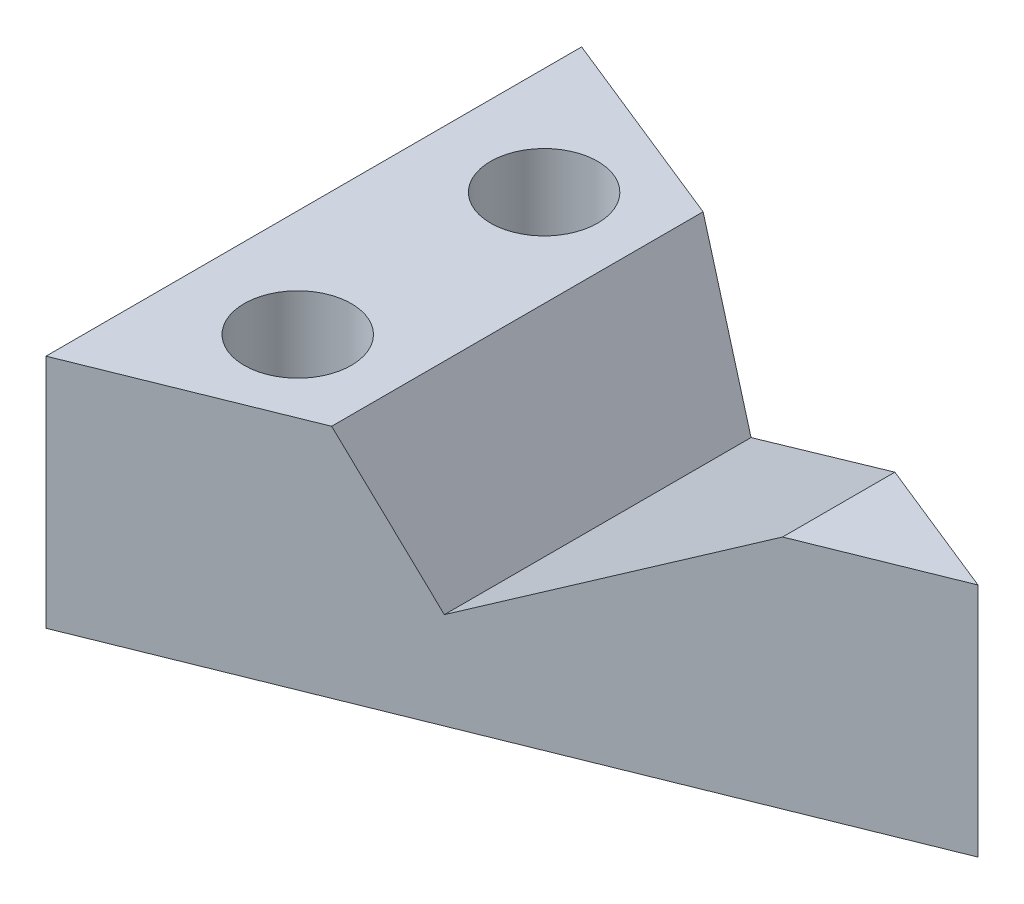
ISO-10303-21;
HEADER;
FILE_DESCRIPTION(('STEP AP214'),'2;1');
FILE_NAME('part.step','',(''),(''),'','','');
FILE_SCHEMA(('AUTOMOTIVE_DESIGN { 1 0 10303 214 1 1 1 1 }'));
ENDSEC;
DATA;
#1=APPLICATION_CONTEXT('core data for automotive mechanical design processes');
#2=APPLICATION_PROTOCOL_DEFINITION('international standard','automotive_design',2000,#1);
#3=PRODUCT_CONTEXT('',#1,'mechanical');
#4=PRODUCT('Part','Part','',(#3));
#5=PRODUCT_RELATED_PRODUCT_CATEGORY('part','',(#4));
#6=PRODUCT_DEFINITION_FORMATION('','',#4);
#7=PRODUCT_DEFINITION_CONTEXT('part definition',#1,'design');
#8=PRODUCT_DEFINITION('design','',#6,#7);
#9=PRODUCT_DEFINITION_SHAPE('','',#8);
#10=(LENGTH_UNIT() NAMED_UNIT(*) SI_UNIT(.MILLI.,.METRE.));
#11=(NAMED_UNIT(*) PLANE_ANGLE_UNIT() SI_UNIT($,.RADIAN.));
#12=(NAMED_UNIT(*) SI_UNIT($,.STERADIAN.) SOLID_ANGLE_UNIT());
#13=UNCERTAINTY_MEASURE_WITH_UNIT(LENGTH_MEASURE(1.E-05),#10,'distance_accuracy_value','');
#14=(GEOMETRIC_REPRESENTATION_CONTEXT(3) GLOBAL_UNCERTAINTY_ASSIGNED_CONTEXT((#13)) GLOBAL_UNIT_ASSIGNED_CONTEXT((#10,
#11,#12)) REPRESENTATION_CONTEXT('',''));
#15=CARTESIAN_POINT('',(0.,0.,0.));
#16=DIRECTION('',(0.,0.,1.));
#17=DIRECTION('',(1.,0.,0.));
#18=AXIS2_PLACEMENT_3D('',#15,#16,#17);
#19=CARTESIAN_POINT('',(-62.,22.,25.));
#20=DIRECTION('',(-0.37396833549694,0.,-0.927441472032412));
#21=DIRECTION('',(-0.927441472032412,0.,0.37396833549694));
#22=AXIS2_PLACEMENT_3D('',#19,#20,#21);
#23=PLANE('',#22);
#24=DIRECTION('',(0.490137720761641,-0.848943435065173,-0.197636177726468));
#25=VECTOR('',#24,1.);
#26=CARTESIAN_POINT('',(-48.3066058371351,31.1913109256597,19.478470095619));
#27=LINE('',#26,#25);
#28=CARTESIAN_POINT('',(-43.,22.,17.3387096774194));
#29=VERTEX_POINT('',#28);
#30=CARTESIAN_POINT('',(-35.5,9.00961894323338,14.3145161290323));
#31=VERTEX_POINT('',#30);
#32=EDGE_CURVE('E96',#29,#31,#27,.T.);
#33=ORIENTED_EDGE('',*,*,#32,.F.);
#34=DIRECTION('',(0.927441472032412,0.,-0.37396833549694));
#35=VECTOR('',#34,1.);
#36=CARTESIAN_POINT('',(-62.,22.,25.));
#37=LINE('',#36,#35);
#38=CARTESIAN_POINT('',(-62.,22.,25.));
#39=VERTEX_POINT('',#38);
#40=EDGE_CURVE('E116',#39,#29,#37,.T.);
#41=ORIENTED_EDGE('',*,*,#40,.F.);
#42=DIRECTION('',(0.,-1.,0.));
#43=VECTOR('',#42,1.);
#44=CARTESIAN_POINT('',(-62.,22.,25.));
#45=LINE('',#44,#43);
#46=CARTESIAN_POINT('',(-62.,0.,25.));
#47=VERTEX_POINT('',#46);
#48=EDGE_CURVE('E122',#39,#47,#45,.T.);
#49=ORIENTED_EDGE('',*,*,#48,.T.);
#50=DIRECTION('',(0.927441472032412,0.,-0.37396833549694));
#51=VECTOR('',#50,1.);
#52=CARTESIAN_POINT('',(-62.,0.,25.));
#53=LINE('',#52,#51);
#54=CARTESIAN_POINT('',(0.,0.,0.));
#55=VERTEX_POINT('',#54);
#56=EDGE_CURVE('E103',#47,#55,#53,.T.);
#57=ORIENTED_EDGE('',*,*,#56,.T.);
#58=DIRECTION('',(0.,-1.,0.));
#59=VECTOR('',#58,1.);
#60=CARTESIAN_POINT('',(0.,22.,0.));
#61=LINE('',#60,#59);
#62=CARTESIAN_POINT('',(0.,22.,0.));
#63=VERTEX_POINT('',#62);
#64=EDGE_CURVE('E131',#63,#55,#61,.T.);
#65=ORIENTED_EDGE('',*,*,#64,.F.);
#66=CARTESIAN_POINT('',(-13.,22.,5.24193548387097));
#67=VERTEX_POINT('',#66);
#68=EDGE_CURVE('E79',#67,#63,#37,.T.);
#69=ORIENTED_EDGE('',*,*,#68,.F.);
#70=DIRECTION('',(0.81760808856905,0.472046250026958,-0.329680680874617));
#71=VECTOR('',#70,1.);
#72=CARTESIAN_POINT('',(-51.0814445539389,0.0136677356535331,20.5973566749753));
#73=LINE('',#72,#71);
#74=EDGE_CURVE('E47',#31,#67,#73,.T.);
#75=ORIENTED_EDGE('',*,*,#74,.F.);
#76=EDGE_LOOP('',(#33,#41,#49,#57,#65,#69,#75));
#77=FACE_BOUND('',#76,.T.);
#78=ADVANCED_FACE('F33',(#77),#23,.F.);
#79=CARTESIAN_POINT('',(0.,22.,0.));
#80=DIRECTION('',(-0.37396833549694,0.,0.927441472032412));
#81=DIRECTION('',(0.927441472032412,0.,0.37396833549694));
#82=AXIS2_PLACEMENT_3D('',#79,#80,#81);
#83=PLANE('',#82);
#84=DIRECTION('',(-0.490137720761641,0.848943435065173,-0.197636177726468));
#85=VECTOR('',#84,1.);
#86=CARTESIAN_POINT('',(-30.990313105431,1.1986121156123,-12.4960939941254));
#87=LINE('',#86,#85);
#88=CARTESIAN_POINT('',(-35.5,9.00961894323337,-14.3145161290323));
#89=VERTEX_POINT('',#88);
#90=CARTESIAN_POINT('',(-43.,22.,-17.3387096774194));
#91=VERTEX_POINT('',#90);
#92=EDGE_CURVE('E104',#89,#91,#87,.T.);
#93=ORIENTED_EDGE('',*,*,#92,.F.);
#94=DIRECTION('',(-0.81760808856905,-0.472046250026958,-0.329680680874617));
#95=VECTOR('',#94,1.);
#96=CARTESIAN_POINT('',(-2.89675960813867,27.8331085599287,-1.16804822908817));
#97=LINE('',#96,#95);
#98=CARTESIAN_POINT('',(-13.,22.,-5.24193548387097));
#99=VERTEX_POINT('',#98);
#100=EDGE_CURVE('E108',#99,#89,#97,.T.);
#101=ORIENTED_EDGE('',*,*,#100,.F.);
#102=DIRECTION('',(-0.927441472032412,0.,-0.37396833549694));
#103=VECTOR('',#102,1.);
#104=CARTESIAN_POINT('',(0.,22.,0.));
#105=LINE('',#104,#103);
#106=EDGE_CURVE('E119',#63,#99,#105,.T.);
#107=ORIENTED_EDGE('',*,*,#106,.F.);
#108=ORIENTED_EDGE('',*,*,#64,.T.);
#109=DIRECTION('',(-0.927441472032412,0.,-0.37396833549694));
#110=VECTOR('',#109,1.);
#111=CARTESIAN_POINT('',(0.,0.,0.));
#112=LINE('',#111,#110);
#113=CARTESIAN_POINT('',(-62.,0.,-25.));
#114=VERTEX_POINT('',#113);
#115=EDGE_CURVE('E125',#55,#114,#112,.T.);
#116=ORIENTED_EDGE('',*,*,#115,.T.);
#117=DIRECTION('',(0.,-1.,0.));
#118=VECTOR('',#117,1.);
#119=CARTESIAN_POINT('',(-62.,22.,-25.));
#120=LINE('',#119,#118);
#121=CARTESIAN_POINT('',(-62.,22.,-25.));
#122=VERTEX_POINT('',#121);
#123=EDGE_CURVE('E129',#122,#114,#120,.T.);
#124=ORIENTED_EDGE('',*,*,#123,.F.);
#125=EDGE_CURVE('E118',#91,#122,#105,.T.);
#126=ORIENTED_EDGE('',*,*,#125,.F.);
#127=EDGE_LOOP('',(#93,#101,#107,#108,#116,#124,#126));
#128=FACE_BOUND('',#127,.T.);
#129=ADVANCED_FACE('F134',(#128),#83,.F.);
#130=CARTESIAN_POINT('',(0.,22.,0.));
#131=DIRECTION('',(0.,-1.,0.));
#132=DIRECTION('',(0.,0.,-1.));
#133=AXIS2_PLACEMENT_3D('',#130,#131,#132);
#134=PLANE('',#133);
#135=CARTESIAN_POINT('',(-52.,22.,11.5));
#136=DIRECTION('',(0.,1.,0.));
#137=DIRECTION('',(0.,0.,1.));
#138=AXIS2_PLACEMENT_3D('',#135,#136,#137);
#139=CIRCLE('',#138,5.);
#140=CARTESIAN_POINT('',(-52.,22.,16.5));
#141=VERTEX_POINT('',#140);
#142=EDGE_CURVE('E171',#141,#141,#139,.T.);
#143=ORIENTED_EDGE('',*,*,#142,.F.);
#144=EDGE_LOOP('',(#143));
#145=FACE_BOUND('',#144,.T.);
#146=CARTESIAN_POINT('',(-52.,22.,-11.5));
#147=DIRECTION('',(0.,1.,0.));
#148=DIRECTION('',(0.,0.,1.));
#149=AXIS2_PLACEMENT_3D('',#146,#147,#148);
#150=CIRCLE('',#149,5.);
#151=CARTESIAN_POINT('',(-52.,22.,-6.5));
#152=VERTEX_POINT('',#151);
#153=EDGE_CURVE('E172',#152,#152,#150,.T.);
#154=ORIENTED_EDGE('',*,*,#153,.F.);
#155=EDGE_LOOP('',(#154));
#156=FACE_BOUND('',#155,.T.);
#157=DIRECTION('',(0.,0.,1.));
#158=VECTOR('',#157,1.);
#159=CARTESIAN_POINT('',(-43.,22.,0.));
#160=LINE('',#159,#158);
#161=EDGE_CURVE('E11',#91,#29,#160,.T.);
#162=ORIENTED_EDGE('',*,*,#161,.F.);
#163=ORIENTED_EDGE('',*,*,#125,.T.);
#164=DIRECTION('',(0.,0.,1.));
#165=VECTOR('',#164,1.);
#166=CARTESIAN_POINT('',(-62.,22.,-25.));
#167=LINE('',#166,#165);
#168=EDGE_CURVE('E56',#122,#39,#167,.T.);
#169=ORIENTED_EDGE('',*,*,#168,.T.);
#170=ORIENTED_EDGE('',*,*,#40,.T.);
#171=EDGE_LOOP('',(#162,#163,#169,#170));
#172=FACE_BOUND('',#171,.T.);
#173=ADVANCED_FACE('F139',(#145,#156,#172),#134,.F.);
#174=DIRECTION('',(0.,0.,-1.));
#175=VECTOR('',#174,1.);
#176=CARTESIAN_POINT('',(-13.,22.,0.));
#177=LINE('',#176,#175);
#178=EDGE_CURVE('E40',#67,#99,#177,.T.);
#179=ORIENTED_EDGE('',*,*,#178,.F.);
#180=ORIENTED_EDGE('',*,*,#68,.T.);
#181=ORIENTED_EDGE('',*,*,#106,.T.);
#182=EDGE_LOOP('',(#179,#180,#181));
#183=FACE_BOUND('',#182,.T.);
#184=ADVANCED_FACE('F136',(#183),#134,.F.);
#185=CARTESIAN_POINT('',(-62.,22.,-25.));
#186=DIRECTION('',(1.,0.,0.));
#187=DIRECTION('',(0.,0.,-1.));
#188=AXIS2_PLACEMENT_3D('',#185,#186,#187);
#189=PLANE('',#188);
#190=DIRECTION('',(0.,0.,1.));
#191=VECTOR('',#190,1.);
#192=CARTESIAN_POINT('',(-62.,0.,-25.));
#193=LINE('',#192,#191);
#194=EDGE_CURVE('E73',#114,#47,#193,.T.);
#195=ORIENTED_EDGE('',*,*,#194,.T.);
#196=ORIENTED_EDGE('',*,*,#48,.F.);
#197=ORIENTED_EDGE('',*,*,#168,.F.);
#198=ORIENTED_EDGE('',*,*,#123,.T.);
#199=EDGE_LOOP('',(#195,#196,#197,#198));
#200=FACE_BOUND('',#199,.T.);
#201=ADVANCED_FACE('F138',(#200),#189,.F.);
#202=CARTESIAN_POINT('',(0.,0.,0.));
#203=DIRECTION('',(0.,-1.,0.));
#204=DIRECTION('',(0.,0.,-1.));
#205=AXIS2_PLACEMENT_3D('',#202,#203,#204);
#206=PLANE('',#205);
#207=CARTESIAN_POINT('',(-52.,0.,11.5));
#208=DIRECTION('',(0.,1.,0.));
#209=DIRECTION('',(0.,0.,1.));
#210=AXIS2_PLACEMENT_3D('',#207,#208,#209);
#211=CIRCLE('',#210,5.);
#212=CARTESIAN_POINT('',(-52.,0.,16.5));
#213=VERTEX_POINT('',#212);
#214=EDGE_CURVE('E109',#213,#213,#211,.T.);
#215=ORIENTED_EDGE('',*,*,#214,.T.);
#216=EDGE_LOOP('',(#215));
#217=FACE_BOUND('',#216,.T.);
#218=CARTESIAN_POINT('',(-52.,0.,-11.5));
#219=DIRECTION('',(0.,1.,0.));
#220=DIRECTION('',(0.,0.,1.));
#221=AXIS2_PLACEMENT_3D('',#218,#219,#220);
#222=CIRCLE('',#221,5.);
#223=CARTESIAN_POINT('',(-52.,0.,-6.5));
#224=VERTEX_POINT('',#223);
#225=EDGE_CURVE('E167',#224,#224,#222,.T.);
#226=ORIENTED_EDGE('',*,*,#225,.T.);
#227=EDGE_LOOP('',(#226));
#228=FACE_BOUND('',#227,.T.);
#229=ORIENTED_EDGE('',*,*,#56,.F.);
#230=ORIENTED_EDGE('',*,*,#194,.F.);
#231=ORIENTED_EDGE('',*,*,#115,.F.);
#232=EDGE_LOOP('',(#229,#230,#231));
#233=FACE_BOUND('',#232,.T.);
#234=ADVANCED_FACE('F145',(#217,#228,#233),#206,.T.);
#235=CARTESIAN_POINT('',(-43.,22.,22.));
#236=DIRECTION('',(0.86602540378444,0.499999999999998,0.));
#237=DIRECTION('',(-0.499999999999998,0.86602540378444,0.));
#238=AXIS2_PLACEMENT_3D('',#235,#236,#237);
#239=PLANE('',#238);
#240=ORIENTED_EDGE('',*,*,#32,.T.);
#241=DIRECTION('',(0.,0.,-1.));
#242=VECTOR('',#241,1.);
#243=CARTESIAN_POINT('',(-35.5,9.00961894323337,22.));
#244=LINE('',#243,#242);
#245=EDGE_CURVE('E98',#31,#89,#244,.T.);
#246=ORIENTED_EDGE('',*,*,#245,.T.);
#247=ORIENTED_EDGE('',*,*,#92,.T.);
#248=ORIENTED_EDGE('',*,*,#161,.T.);
#249=EDGE_LOOP('',(#240,#246,#247,#248));
#250=FACE_BOUND('',#249,.T.);
#251=ADVANCED_FACE('F97',(#250),#239,.T.);
#252=CARTESIAN_POINT('',(-35.5,9.00961894323337,22.));
#253=DIRECTION('',(-0.500000000000001,0.866025403784438,0.));
#254=DIRECTION('',(-0.866025403784438,-0.500000000000001,0.));
#255=AXIS2_PLACEMENT_3D('',#252,#253,#254);
#256=PLANE('',#255);
#257=ORIENTED_EDGE('',*,*,#74,.T.);
#258=ORIENTED_EDGE('',*,*,#178,.T.);
#259=ORIENTED_EDGE('',*,*,#100,.T.);
#260=ORIENTED_EDGE('',*,*,#245,.F.);
#261=EDGE_LOOP('',(#257,#258,#259,#260));
#262=FACE_BOUND('',#261,.T.);
#263=ADVANCED_FACE('F106',(#262),#256,.T.);
#264=CARTESIAN_POINT('',(-52.,0.,-11.5));
#265=DIRECTION('',(0.,1.,0.));
#266=DIRECTION('',(0.,0.,1.));
#267=AXIS2_PLACEMENT_3D('',#264,#265,#266);
#268=CYLINDRICAL_SURFACE('',#267,5.);
#269=ORIENTED_EDGE('',*,*,#225,.F.);
#270=EDGE_LOOP('',(#269));
#271=FACE_BOUND('',#270,.T.);
#272=ORIENTED_EDGE('',*,*,#153,.T.);
#273=EDGE_LOOP('',(#272));
#274=FACE_BOUND('',#273,.T.);
#275=ADVANCED_FACE('F181',(#271,#274),#268,.F.);
#276=CARTESIAN_POINT('',(-52.,0.,11.5));
#277=DIRECTION('',(0.,1.,0.));
#278=DIRECTION('',(0.,0.,1.));
#279=AXIS2_PLACEMENT_3D('',#276,#277,#278);
#280=CYLINDRICAL_SURFACE('',#279,5.);
#281=ORIENTED_EDGE('',*,*,#214,.F.);
#282=EDGE_LOOP('',(#281));
#283=FACE_BOUND('',#282,.T.);
#284=ORIENTED_EDGE('',*,*,#142,.T.);
#285=EDGE_LOOP('',(#284));
#286=FACE_BOUND('',#285,.T.);
#287=ADVANCED_FACE('F184',(#283,#286),#280,.F.);
#288=CLOSED_SHELL('',(#78,#129,#173,#184,#201,#234,#251,#263,#275,#287));
#289=MANIFOLD_SOLID_BREP('B2',#288);
#290=ADVANCED_BREP_SHAPE_REPRESENTATION('',(#18,#289),#14);
#291=SHAPE_DEFINITION_REPRESENTATION(#9,#290);
ENDSEC;
END-ISO-10303-21;
